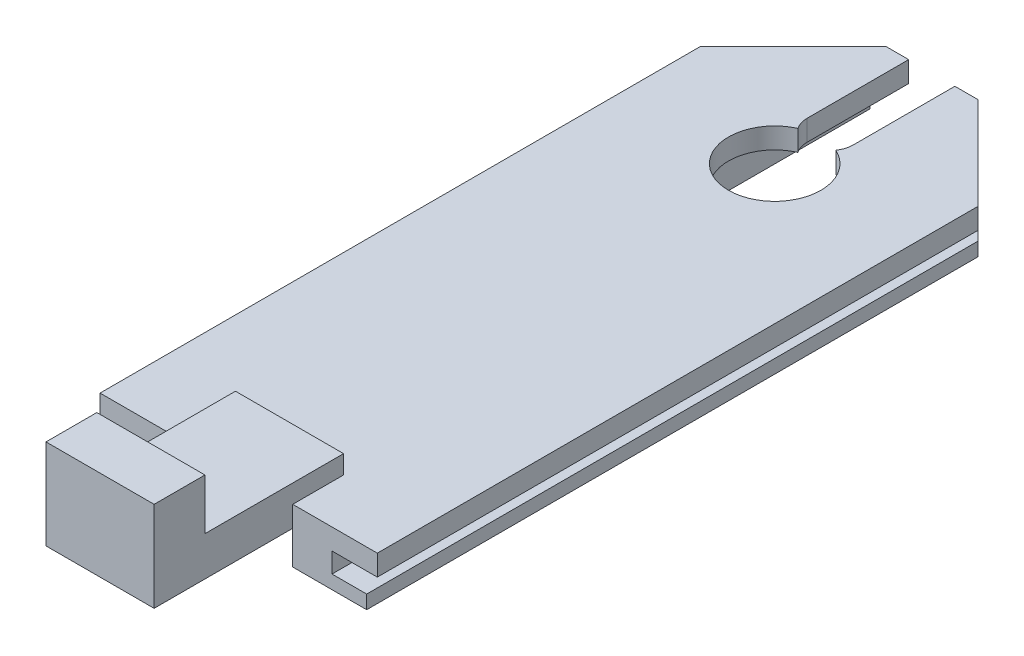
ISO-10303-21;
HEADER;
FILE_DESCRIPTION(('STEP AP214'),'2;1');
FILE_NAME('part.step','',(''),(''),'','','');
FILE_SCHEMA(('AUTOMOTIVE_DESIGN { 1 0 10303 214 1 1 1 1 }'));
ENDSEC;
DATA;
#1=APPLICATION_CONTEXT('core data for automotive mechanical design processes');
#2=APPLICATION_PROTOCOL_DEFINITION('international standard','automotive_design',2000,#1);
#3=PRODUCT_CONTEXT('',#1,'mechanical');
#4=PRODUCT('Part','Part','',(#3));
#5=PRODUCT_RELATED_PRODUCT_CATEGORY('part','',(#4));
#6=PRODUCT_DEFINITION_FORMATION('','',#4);
#7=PRODUCT_DEFINITION_CONTEXT('part definition',#1,'design');
#8=PRODUCT_DEFINITION('design','',#6,#7);
#9=PRODUCT_DEFINITION_SHAPE('','',#8);
#10=(LENGTH_UNIT() NAMED_UNIT(*) SI_UNIT(.MILLI.,.METRE.));
#11=(NAMED_UNIT(*) PLANE_ANGLE_UNIT() SI_UNIT($,.RADIAN.));
#12=(NAMED_UNIT(*) SI_UNIT($,.STERADIAN.) SOLID_ANGLE_UNIT());
#13=UNCERTAINTY_MEASURE_WITH_UNIT(LENGTH_MEASURE(1.E-05),#10,'distance_accuracy_value','');
#14=(GEOMETRIC_REPRESENTATION_CONTEXT(3) GLOBAL_UNCERTAINTY_ASSIGNED_CONTEXT((#13)) GLOBAL_UNIT_ASSIGNED_CONTEXT((#10,
#11,#12)) REPRESENTATION_CONTEXT('',''));
#15=CARTESIAN_POINT('',(0.,0.,0.));
#16=DIRECTION('',(0.,0.,1.));
#17=DIRECTION('',(1.,0.,0.));
#18=AXIS2_PLACEMENT_3D('',#15,#16,#17);
#19=CARTESIAN_POINT('',(0.,-16.646180048888,11.));
#20=DIRECTION('',(0.,1.,0.));
#21=DIRECTION('',(-1.,0.,0.));
#22=AXIS2_PLACEMENT_3D('',#19,#20,#21);
#23=CYLINDRICAL_SURFACE('',#22,2.5);
#24=CARTESIAN_POINT('',(0.,-2.25,11.));
#25=DIRECTION('',(0.,1.,0.));
#26=DIRECTION('',(-1.,0.,0.));
#27=AXIS2_PLACEMENT_3D('',#24,#25,#26);
#28=CIRCLE('',#27,2.5);
#29=CARTESIAN_POINT('',(2.5,-2.25,11.));
#30=VERTEX_POINT('',#29);
#31=CARTESIAN_POINT('',(2.0453835214942,-2.25,12.4375));
#32=VERTEX_POINT('',#31);
#33=EDGE_CURVE('E269',#30,#32,#28,.F.);
#34=ORIENTED_EDGE('',*,*,#33,.T.);
#35=DIRECTION('',(0.,1.,0.));
#36=VECTOR('',#35,1.);
#37=CARTESIAN_POINT('',(2.0453835214942,-1.125,12.4375));
#38=LINE('',#37,#36);
#39=CARTESIAN_POINT('',(2.0453835214942,0.,12.4375));
#40=VERTEX_POINT('',#39);
#41=EDGE_CURVE('E251',#32,#40,#38,.T.);
#42=ORIENTED_EDGE('',*,*,#41,.T.);
#43=CARTESIAN_POINT('',(0.,0.,11.));
#44=DIRECTION('',(0.,1.,0.));
#45=DIRECTION('',(-1.,0.,0.));
#46=AXIS2_PLACEMENT_3D('',#43,#44,#45);
#47=CIRCLE('',#46,2.5);
#48=CARTESIAN_POINT('',(2.5,0.,11.));
#49=VERTEX_POINT('',#48);
#50=EDGE_CURVE('E294',#40,#49,#47,.T.);
#51=ORIENTED_EDGE('',*,*,#50,.T.);
#52=DIRECTION('',(0.,1.,0.));
#53=VECTOR('',#52,1.);
#54=CARTESIAN_POINT('',(2.5,-16.646180048888,11.));
#55=LINE('',#54,#53);
#56=EDGE_CURVE('E277',#30,#49,#55,.T.);
#57=ORIENTED_EDGE('',*,*,#56,.F.);
#58=EDGE_LOOP('',(#34,#42,#51,#57));
#59=FACE_BOUND('',#58,.T.);
#60=ADVANCED_FACE('F47',(#59),#23,.F.);
#61=CARTESIAN_POINT('',(-15.,0.,75.));
#62=DIRECTION('',(0.,-1.,0.));
#63=DIRECTION('',(1.,0.,0.));
#64=AXIS2_PLACEMENT_3D('',#61,#62,#63);
#65=PLANE('',#64);
#66=DIRECTION('',(-1.,0.,0.));
#67=VECTOR('',#66,1.);
#68=CARTESIAN_POINT('',(-15.,0.,0.));
#69=LINE('',#68,#67);
#70=CARTESIAN_POINT('',(-2.5,0.,0.));
#71=VERTEX_POINT('',#70);
#72=CARTESIAN_POINT('',(-4.99999999999996,0.,0.));
#73=VERTEX_POINT('',#72);
#74=EDGE_CURVE('E283',#71,#73,#69,.T.);
#75=ORIENTED_EDGE('',*,*,#74,.T.);
#76=DIRECTION('',(-0.707106781186549,0.,0.707106781186547));
#77=VECTOR('',#76,1.);
#78=CARTESIAN_POINT('',(-15.,0.,10.));
#79=LINE('',#78,#77);
#80=CARTESIAN_POINT('',(-15.,0.,10.));
#81=VERTEX_POINT('',#80);
#82=EDGE_CURVE('E11',#73,#81,#79,.T.);
#83=ORIENTED_EDGE('',*,*,#82,.T.);
#84=DIRECTION('',(0.,0.,-1.));
#85=VECTOR('',#84,1.);
#86=CARTESIAN_POINT('',(-15.,0.,75.));
#87=LINE('',#86,#85);
#88=CARTESIAN_POINT('',(-15.,0.,75.));
#89=VERTEX_POINT('',#88);
#90=EDGE_CURVE('E424',#89,#81,#87,.T.);
#91=ORIENTED_EDGE('',*,*,#90,.F.);
#92=DIRECTION('',(-1.,0.,0.));
#93=VECTOR('',#92,1.);
#94=CARTESIAN_POINT('',(-15.,0.,75.));
#95=LINE('',#94,#93);
#96=CARTESIAN_POINT('',(-5.85,0.,75.));
#97=VERTEX_POINT('',#96);
#98=EDGE_CURVE('E318',#97,#89,#95,.T.);
#99=ORIENTED_EDGE('',*,*,#98,.F.);
#100=DIRECTION('',(0.,0.,1.));
#101=VECTOR('',#100,1.);
#102=CARTESIAN_POINT('',(-5.85,0.,69.5));
#103=LINE('',#102,#101);
#104=CARTESIAN_POINT('',(-5.85,0.,69.5));
#105=VERTEX_POINT('',#104);
#106=EDGE_CURVE('E518',#105,#97,#103,.T.);
#107=ORIENTED_EDGE('',*,*,#106,.F.);
#108=DIRECTION('',(-1.,0.,0.));
#109=VECTOR('',#108,1.);
#110=CARTESIAN_POINT('',(5.85,0.,69.5));
#111=LINE('',#110,#109);
#112=CARTESIAN_POINT('',(5.85,0.,69.5));
#113=VERTEX_POINT('',#112);
#114=EDGE_CURVE('E629',#113,#105,#111,.T.);
#115=ORIENTED_EDGE('',*,*,#114,.F.);
#116=DIRECTION('',(0.,0.,1.));
#117=VECTOR('',#116,1.);
#118=CARTESIAN_POINT('',(5.85,0.,69.5));
#119=LINE('',#118,#117);
#120=CARTESIAN_POINT('',(5.85,0.,75.));
#121=VERTEX_POINT('',#120);
#122=EDGE_CURVE('E527',#113,#121,#119,.T.);
#123=ORIENTED_EDGE('',*,*,#122,.T.);
#124=CARTESIAN_POINT('',(15.,0.,75.));
#125=VERTEX_POINT('',#124);
#126=EDGE_CURVE('E320',#125,#121,#95,.T.);
#127=ORIENTED_EDGE('',*,*,#126,.F.);
#128=DIRECTION('',(0.,0.,-1.));
#129=VECTOR('',#128,1.);
#130=CARTESIAN_POINT('',(15.,0.,75.));
#131=LINE('',#130,#129);
#132=CARTESIAN_POINT('',(15.,0.,10.));
#133=VERTEX_POINT('',#132);
#134=EDGE_CURVE('E428',#125,#133,#131,.T.);
#135=ORIENTED_EDGE('',*,*,#134,.T.);
#136=DIRECTION('',(-0.707106781186549,0.,-0.707106781186547));
#137=VECTOR('',#136,1.);
#138=CARTESIAN_POINT('',(15.,0.,10.));
#139=LINE('',#138,#137);
#140=CARTESIAN_POINT('',(4.99999999999996,0.,0.));
#141=VERTEX_POINT('',#140);
#142=EDGE_CURVE('E437',#133,#141,#139,.T.);
#143=ORIENTED_EDGE('',*,*,#142,.T.);
#144=CARTESIAN_POINT('',(2.5,0.,0.));
#145=VERTEX_POINT('',#144);
#146=EDGE_CURVE('E364',#141,#145,#69,.T.);
#147=ORIENTED_EDGE('',*,*,#146,.T.);
#148=DIRECTION('',(0.,0.,-1.));
#149=VECTOR('',#148,1.);
#150=CARTESIAN_POINT('',(2.5,0.,11.));
#151=LINE('',#150,#149);
#152=EDGE_CURVE('E293',#49,#145,#151,.T.);
#153=ORIENTED_EDGE('',*,*,#152,.F.);
#154=ORIENTED_EDGE('',*,*,#50,.F.);
#155=CARTESIAN_POINT('',(0.,0.,17.));
#156=DIRECTION('',(0.,1.,0.));
#157=DIRECTION('',(-1.,0.,0.));
#158=AXIS2_PLACEMENT_3D('',#155,#156,#157);
#159=CIRCLE('',#158,5.);
#160=CARTESIAN_POINT('',(-2.0453835214942,0.,12.4375));
#161=VERTEX_POINT('',#160);
#162=EDGE_CURVE('E257',#161,#40,#159,.T.);
#163=ORIENTED_EDGE('',*,*,#162,.F.);
#164=CARTESIAN_POINT('',(-2.5,0.,11.));
#165=VERTEX_POINT('',#164);
#166=EDGE_CURVE('E289',#165,#161,#47,.T.);
#167=ORIENTED_EDGE('',*,*,#166,.F.);
#168=DIRECTION('',(0.,0.,1.));
#169=VECTOR('',#168,1.);
#170=CARTESIAN_POINT('',(-2.5,0.,0.));
#171=LINE('',#170,#169);
#172=EDGE_CURVE('E298',#71,#165,#171,.T.);
#173=ORIENTED_EDGE('',*,*,#172,.F.);
#174=EDGE_LOOP('',(#75,#83,#91,#99,#107,#115,#123,#127,#135,#143,#147,#153,#154,#163,#167,#173));
#175=FACE_BOUND('',#174,.T.);
#176=ADVANCED_FACE('F495',(#175),#65,.F.);
#177=CARTESIAN_POINT('',(-5.85,7.5,84.5));
#178=DIRECTION('',(0.,0.,1.));
#179=DIRECTION('',(1.,0.,0.));
#180=AXIS2_PLACEMENT_3D('',#177,#178,#179);
#181=PLANE('',#180);
#182=DIRECTION('',(1.,0.,0.));
#183=VECTOR('',#182,1.);
#184=CARTESIAN_POINT('',(5.85,2.,84.5));
#185=LINE('',#184,#183);
#186=CARTESIAN_POINT('',(-5.85,2.,84.5));
#187=VERTEX_POINT('',#186);
#188=CARTESIAN_POINT('',(5.85,2.,84.5));
#189=VERTEX_POINT('',#188);
#190=EDGE_CURVE('E273',#187,#189,#185,.T.);
#191=ORIENTED_EDGE('',*,*,#190,.F.);
#192=DIRECTION('',(0.,-1.,0.));
#193=VECTOR('',#192,1.);
#194=CARTESIAN_POINT('',(-5.85,7.5,84.5));
#195=LINE('',#194,#193);
#196=CARTESIAN_POINT('',(-5.85,7.5,84.5));
#197=VERTEX_POINT('',#196);
#198=EDGE_CURVE('E552',#197,#187,#195,.T.);
#199=ORIENTED_EDGE('',*,*,#198,.F.);
#200=DIRECTION('',(-1.,0.,0.));
#201=VECTOR('',#200,1.);
#202=CARTESIAN_POINT('',(-5.85,7.5,84.5));
#203=LINE('',#202,#201);
#204=CARTESIAN_POINT('',(5.85,7.5,84.5));
#205=VERTEX_POINT('',#204);
#206=EDGE_CURVE('E549',#205,#197,#203,.T.);
#207=ORIENTED_EDGE('',*,*,#206,.F.);
#208=DIRECTION('',(0.,-1.,0.));
#209=VECTOR('',#208,1.);
#210=CARTESIAN_POINT('',(5.85,7.5,84.5));
#211=LINE('',#210,#209);
#212=EDGE_CURVE('E556',#205,#189,#211,.T.);
#213=ORIENTED_EDGE('',*,*,#212,.T.);
#214=EDGE_LOOP('',(#191,#199,#207,#213));
#215=FACE_BOUND('',#214,.T.);
#216=ADVANCED_FACE('F619',(#215),#181,.F.);
#217=CARTESIAN_POINT('',(0.,0.,75.));
#218=DIRECTION('',(0.,0.,-1.));
#219=DIRECTION('',(-1.,0.,0.));
#220=AXIS2_PLACEMENT_3D('',#217,#218,#219);
#221=PLANE('',#220);
#222=DIRECTION('',(0.,-1.,0.));
#223=VECTOR('',#222,1.);
#224=CARTESIAN_POINT('',(-5.85,-2.25,75.));
#225=LINE('',#224,#223);
#226=CARTESIAN_POINT('',(-5.85,-2.25,75.));
#227=VERTEX_POINT('',#226);
#228=EDGE_CURVE('E516',#97,#227,#225,.T.);
#229=ORIENTED_EDGE('',*,*,#228,.F.);
#230=ORIENTED_EDGE('',*,*,#98,.T.);
#231=DIRECTION('',(0.,-1.,0.));
#232=VECTOR('',#231,1.);
#233=CARTESIAN_POINT('',(-15.,0.,75.));
#234=LINE('',#233,#232);
#235=CARTESIAN_POINT('',(-15.,-2.25,75.));
#236=VERTEX_POINT('',#235);
#237=EDGE_CURVE('E324',#89,#236,#234,.T.);
#238=ORIENTED_EDGE('',*,*,#237,.T.);
#239=DIRECTION('',(1.,0.,0.));
#240=VECTOR('',#239,1.);
#241=CARTESIAN_POINT('',(-15.,-2.25,75.));
#242=LINE('',#241,#240);
#243=CARTESIAN_POINT('',(-10.1,-2.25,75.));
#244=VERTEX_POINT('',#243);
#245=EDGE_CURVE('E327',#236,#244,#242,.T.);
#246=ORIENTED_EDGE('',*,*,#245,.T.);
#247=DIRECTION('',(0.,-1.,0.));
#248=VECTOR('',#247,1.);
#249=CARTESIAN_POINT('',(-10.1,-2.25,75.));
#250=LINE('',#249,#248);
#251=CARTESIAN_POINT('',(-10.1,-4.41,75.));
#252=VERTEX_POINT('',#251);
#253=EDGE_CURVE('E330',#244,#252,#250,.T.);
#254=ORIENTED_EDGE('',*,*,#253,.T.);
#255=DIRECTION('',(-1.,0.,0.));
#256=VECTOR('',#255,1.);
#257=CARTESIAN_POINT('',(-10.1,-4.41,75.));
#258=LINE('',#257,#256);
#259=CARTESIAN_POINT('',(-13.85,-4.41,75.));
#260=VERTEX_POINT('',#259);
#261=EDGE_CURVE('E333',#252,#260,#258,.T.);
#262=ORIENTED_EDGE('',*,*,#261,.T.);
#263=DIRECTION('',(0.,-1.,0.));
#264=VECTOR('',#263,1.);
#265=CARTESIAN_POINT('',(-13.85,-4.41,75.));
#266=LINE('',#265,#264);
#267=CARTESIAN_POINT('',(-13.85,-5.88,75.));
#268=VERTEX_POINT('',#267);
#269=EDGE_CURVE('E336',#260,#268,#266,.T.);
#270=ORIENTED_EDGE('',*,*,#269,.T.);
#271=DIRECTION('',(1.,0.,0.));
#272=VECTOR('',#271,1.);
#273=CARTESIAN_POINT('',(-13.85,-5.88,75.));
#274=LINE('',#273,#272);
#275=CARTESIAN_POINT('',(-5.85,-5.88,75.));
#276=VERTEX_POINT('',#275);
#277=EDGE_CURVE('E339',#268,#276,#274,.T.);
#278=ORIENTED_EDGE('',*,*,#277,.T.);
#279=DIRECTION('',(0.,1.,0.));
#280=VECTOR('',#279,1.);
#281=CARTESIAN_POINT('',(-5.85,-5.88,75.));
#282=LINE('',#281,#280);
#283=EDGE_CURVE('E342',#276,#227,#282,.T.);
#284=ORIENTED_EDGE('',*,*,#283,.T.);
#285=EDGE_LOOP('',(#229,#230,#238,#246,#254,#262,#270,#278,#284));
#286=FACE_BOUND('',#285,.T.);
#287=ADVANCED_FACE('F512',(#286),#221,.F.);
#288=DIRECTION('',(0.,1.,0.));
#289=VECTOR('',#288,1.);
#290=CARTESIAN_POINT('',(5.85,-2.25,75.));
#291=LINE('',#290,#289);
#292=CARTESIAN_POINT('',(5.85,-2.25,75.));
#293=VERTEX_POINT('',#292);
#294=EDGE_CURVE('E564',#293,#121,#291,.T.);
#295=ORIENTED_EDGE('',*,*,#294,.F.);
#296=DIRECTION('',(0.,-1.,0.));
#297=VECTOR('',#296,1.);
#298=CARTESIAN_POINT('',(5.85,-5.88,75.));
#299=LINE('',#298,#297);
#300=CARTESIAN_POINT('',(5.85,-5.88,75.));
#301=VERTEX_POINT('',#300);
#302=EDGE_CURVE('E345',#293,#301,#299,.T.);
#303=ORIENTED_EDGE('',*,*,#302,.T.);
#304=DIRECTION('',(1.,0.,0.));
#305=VECTOR('',#304,1.);
#306=CARTESIAN_POINT('',(13.85,-5.88,75.));
#307=LINE('',#306,#305);
#308=CARTESIAN_POINT('',(13.85,-5.88,75.));
#309=VERTEX_POINT('',#308);
#310=EDGE_CURVE('E348',#301,#309,#307,.T.);
#311=ORIENTED_EDGE('',*,*,#310,.T.);
#312=DIRECTION('',(0.,1.,0.));
#313=VECTOR('',#312,1.);
#314=CARTESIAN_POINT('',(13.85,-4.41,75.));
#315=LINE('',#314,#313);
#316=CARTESIAN_POINT('',(13.85,-4.41,75.));
#317=VERTEX_POINT('',#316);
#318=EDGE_CURVE('E351',#309,#317,#315,.T.);
#319=ORIENTED_EDGE('',*,*,#318,.T.);
#320=DIRECTION('',(-1.,0.,0.));
#321=VECTOR('',#320,1.);
#322=CARTESIAN_POINT('',(10.1,-4.41,75.));
#323=LINE('',#322,#321);
#324=CARTESIAN_POINT('',(10.1,-4.41,75.));
#325=VERTEX_POINT('',#324);
#326=EDGE_CURVE('E354',#317,#325,#323,.T.);
#327=ORIENTED_EDGE('',*,*,#326,.T.);
#328=DIRECTION('',(0.,1.,0.));
#329=VECTOR('',#328,1.);
#330=CARTESIAN_POINT('',(10.1,-2.25,75.));
#331=LINE('',#330,#329);
#332=CARTESIAN_POINT('',(10.1,-2.25,75.));
#333=VERTEX_POINT('',#332);
#334=EDGE_CURVE('E357',#325,#333,#331,.T.);
#335=ORIENTED_EDGE('',*,*,#334,.T.);
#336=DIRECTION('',(1.,0.,0.));
#337=VECTOR('',#336,1.);
#338=CARTESIAN_POINT('',(15.,-2.25,75.));
#339=LINE('',#338,#337);
#340=CARTESIAN_POINT('',(15.,-2.25,75.));
#341=VERTEX_POINT('',#340);
#342=EDGE_CURVE('E360',#333,#341,#339,.T.);
#343=ORIENTED_EDGE('',*,*,#342,.T.);
#344=DIRECTION('',(0.,1.,0.));
#345=VECTOR('',#344,1.);
#346=CARTESIAN_POINT('',(15.,0.,75.));
#347=LINE('',#346,#345);
#348=EDGE_CURVE('E314',#341,#125,#347,.T.);
#349=ORIENTED_EDGE('',*,*,#348,.T.);
#350=ORIENTED_EDGE('',*,*,#126,.T.);
#351=EDGE_LOOP('',(#295,#303,#311,#319,#327,#335,#343,#349,#350));
#352=FACE_BOUND('',#351,.T.);
#353=ADVANCED_FACE('F645',(#352),#221,.F.);
#354=CARTESIAN_POINT('',(0.,0.,0.));
#355=DIRECTION('',(0.,0.,-1.));
#356=DIRECTION('',(-1.,0.,0.));
#357=AXIS2_PLACEMENT_3D('',#354,#355,#356);
#358=PLANE('',#357);
#359=DIRECTION('',(1.,0.,0.));
#360=VECTOR('',#359,1.);
#361=CARTESIAN_POINT('',(5.85,-2.25,0.));
#362=LINE('',#361,#360);
#363=CARTESIAN_POINT('',(-4.99999999999996,-2.25,0.));
#364=VERTEX_POINT('',#363);
#365=CARTESIAN_POINT('',(-2.5,-2.25,0.));
#366=VERTEX_POINT('',#365);
#367=EDGE_CURVE('E319',#364,#366,#362,.T.);
#368=ORIENTED_EDGE('',*,*,#367,.F.);
#369=DIRECTION('',(0.,1.,0.));
#370=VECTOR('',#369,1.);
#371=CARTESIAN_POINT('',(-4.99999999999996,0.,0.));
#372=LINE('',#371,#370);
#373=EDGE_CURVE('E57',#364,#73,#372,.T.);
#374=ORIENTED_EDGE('',*,*,#373,.T.);
#375=ORIENTED_EDGE('',*,*,#74,.F.);
#376=DIRECTION('',(0.,1.,0.));
#377=VECTOR('',#376,1.);
#378=CARTESIAN_POINT('',(-2.5,-16.646180048888,0.));
#379=LINE('',#378,#377);
#380=EDGE_CURVE('E305',#366,#71,#379,.T.);
#381=ORIENTED_EDGE('',*,*,#380,.F.);
#382=EDGE_LOOP('',(#368,#374,#375,#381));
#383=FACE_BOUND('',#382,.T.);
#384=ADVANCED_FACE('F700',(#383),#358,.T.);
#385=CARTESIAN_POINT('',(15.,0.,75.));
#386=DIRECTION('',(-1.,0.,0.));
#387=DIRECTION('',(0.,0.,1.));
#388=AXIS2_PLACEMENT_3D('',#385,#386,#387);
#389=PLANE('',#388);
#390=DIRECTION('',(0.,0.,-1.));
#391=VECTOR('',#390,1.);
#392=CARTESIAN_POINT('',(15.,-2.25,75.));
#393=LINE('',#392,#391);
#394=CARTESIAN_POINT('',(15.,-2.25,10.));
#395=VERTEX_POINT('',#394);
#396=EDGE_CURVE('E363',#341,#395,#393,.T.);
#397=ORIENTED_EDGE('',*,*,#396,.T.);
#398=DIRECTION('',(0.,1.,0.));
#399=VECTOR('',#398,1.);
#400=CARTESIAN_POINT('',(15.,0.,10.));
#401=LINE('',#400,#399);
#402=EDGE_CURVE('E262',#395,#133,#401,.T.);
#403=ORIENTED_EDGE('',*,*,#402,.T.);
#404=ORIENTED_EDGE('',*,*,#134,.F.);
#405=ORIENTED_EDGE('',*,*,#348,.F.);
#406=EDGE_LOOP('',(#397,#403,#404,#405));
#407=FACE_BOUND('',#406,.T.);
#408=ADVANCED_FACE('F651',(#407),#389,.F.);
#409=CARTESIAN_POINT('',(-15.,0.,75.));
#410=DIRECTION('',(1.,0.,0.));
#411=DIRECTION('',(0.,0.,-1.));
#412=AXIS2_PLACEMENT_3D('',#409,#410,#411);
#413=PLANE('',#412);
#414=ORIENTED_EDGE('',*,*,#90,.T.);
#415=DIRECTION('',(0.,-1.,0.));
#416=VECTOR('',#415,1.);
#417=CARTESIAN_POINT('',(-15.,-2.25,10.));
#418=LINE('',#417,#416);
#419=CARTESIAN_POINT('',(-15.,-2.25,10.));
#420=VERTEX_POINT('',#419);
#421=EDGE_CURVE('E464',#81,#420,#418,.T.);
#422=ORIENTED_EDGE('',*,*,#421,.T.);
#423=DIRECTION('',(0.,0.,-1.));
#424=VECTOR('',#423,1.);
#425=CARTESIAN_POINT('',(-15.,-2.25,75.));
#426=LINE('',#425,#424);
#427=EDGE_CURVE('E420',#236,#420,#426,.T.);
#428=ORIENTED_EDGE('',*,*,#427,.F.);
#429=ORIENTED_EDGE('',*,*,#237,.F.);
#430=EDGE_LOOP('',(#414,#422,#428,#429));
#431=FACE_BOUND('',#430,.T.);
#432=ADVANCED_FACE('F504',(#431),#413,.F.);
#433=CARTESIAN_POINT('',(-15.,-2.25,75.));
#434=DIRECTION('',(0.,1.,0.));
#435=DIRECTION('',(-1.,0.,0.));
#436=AXIS2_PLACEMENT_3D('',#433,#434,#435);
#437=PLANE('',#436);
#438=ORIENTED_EDGE('',*,*,#427,.T.);
#439=DIRECTION('',(0.707106781186549,0.,-0.707106781186547));
#440=VECTOR('',#439,1.);
#441=CARTESIAN_POINT('',(-15.,-2.25,10.));
#442=LINE('',#441,#440);
#443=CARTESIAN_POINT('',(-10.1,-2.25,5.10000000000002));
#444=VERTEX_POINT('',#443);
#445=EDGE_CURVE('E468',#420,#444,#442,.T.);
#446=ORIENTED_EDGE('',*,*,#445,.T.);
#447=DIRECTION('',(0.,0.,-1.));
#448=VECTOR('',#447,1.);
#449=CARTESIAN_POINT('',(-10.1,-2.25,75.));
#450=LINE('',#449,#448);
#451=EDGE_CURVE('E416',#244,#444,#450,.T.);
#452=ORIENTED_EDGE('',*,*,#451,.F.);
#453=ORIENTED_EDGE('',*,*,#245,.F.);
#454=EDGE_LOOP('',(#438,#446,#452,#453));
#455=FACE_BOUND('',#454,.T.);
#456=ADVANCED_FACE('F508',(#455),#437,.F.);
#457=CARTESIAN_POINT('',(-10.1,-2.25,75.));
#458=DIRECTION('',(1.,0.,0.));
#459=DIRECTION('',(0.,1.,0.));
#460=AXIS2_PLACEMENT_3D('',#457,#458,#459);
#461=PLANE('',#460);
#462=ORIENTED_EDGE('',*,*,#451,.T.);
#463=DIRECTION('',(0.,-1.,0.));
#464=VECTOR('',#463,1.);
#465=CARTESIAN_POINT('',(-10.1,0.,5.10000000000002));
#466=LINE('',#465,#464);
#467=CARTESIAN_POINT('',(-10.1,-4.41,5.10000000000002));
#468=VERTEX_POINT('',#467);
#469=EDGE_CURVE('E471',#444,#468,#466,.T.);
#470=ORIENTED_EDGE('',*,*,#469,.T.);
#471=DIRECTION('',(0.,0.,-1.));
#472=VECTOR('',#471,1.);
#473=CARTESIAN_POINT('',(-10.1,-4.41,75.));
#474=LINE('',#473,#472);
#475=EDGE_CURVE('E412',#252,#468,#474,.T.);
#476=ORIENTED_EDGE('',*,*,#475,.F.);
#477=ORIENTED_EDGE('',*,*,#253,.F.);
#478=EDGE_LOOP('',(#462,#470,#476,#477));
#479=FACE_BOUND('',#478,.T.);
#480=ADVANCED_FACE('F888',(#479),#461,.F.);
#481=CARTESIAN_POINT('',(-10.1,-4.41,75.));
#482=DIRECTION('',(0.,-1.,0.));
#483=DIRECTION('',(1.,0.,0.));
#484=AXIS2_PLACEMENT_3D('',#481,#482,#483);
#485=PLANE('',#484);
#486=ORIENTED_EDGE('',*,*,#475,.T.);
#487=DIRECTION('',(-0.707106781186549,0.,0.707106781186547));
#488=VECTOR('',#487,1.);
#489=CARTESIAN_POINT('',(-15.,-4.41,10.));
#490=LINE('',#489,#488);
#491=CARTESIAN_POINT('',(-13.85,-4.41,8.85000000000001));
#492=VERTEX_POINT('',#491);
#493=EDGE_CURVE('E474',#468,#492,#490,.T.);
#494=ORIENTED_EDGE('',*,*,#493,.T.);
#495=DIRECTION('',(0.,0.,-1.));
#496=VECTOR('',#495,1.);
#497=CARTESIAN_POINT('',(-13.85,-4.41,75.));
#498=LINE('',#497,#496);
#499=EDGE_CURVE('E408',#260,#492,#498,.T.);
#500=ORIENTED_EDGE('',*,*,#499,.F.);
#501=ORIENTED_EDGE('',*,*,#261,.F.);
#502=EDGE_LOOP('',(#486,#494,#500,#501));
#503=FACE_BOUND('',#502,.T.);
#504=ADVANCED_FACE('F876',(#503),#485,.F.);
#505=CARTESIAN_POINT('',(-13.85,-4.41,75.));
#506=DIRECTION('',(1.,0.,0.));
#507=DIRECTION('',(0.,0.,-1.));
#508=AXIS2_PLACEMENT_3D('',#505,#506,#507);
#509=PLANE('',#508);
#510=ORIENTED_EDGE('',*,*,#499,.T.);
#511=DIRECTION('',(0.,-1.,0.));
#512=VECTOR('',#511,1.);
#513=CARTESIAN_POINT('',(-13.85,0.,8.85000000000001));
#514=LINE('',#513,#512);
#515=CARTESIAN_POINT('',(-13.85,-5.88,8.85000000000001));
#516=VERTEX_POINT('',#515);
#517=EDGE_CURVE('E477',#492,#516,#514,.T.);
#518=ORIENTED_EDGE('',*,*,#517,.T.);
#519=DIRECTION('',(0.,0.,-1.));
#520=VECTOR('',#519,1.);
#521=CARTESIAN_POINT('',(-13.85,-5.88,75.));
#522=LINE('',#521,#520);
#523=EDGE_CURVE('E404',#268,#516,#522,.T.);
#524=ORIENTED_EDGE('',*,*,#523,.F.);
#525=ORIENTED_EDGE('',*,*,#269,.F.);
#526=EDGE_LOOP('',(#510,#518,#524,#525));
#527=FACE_BOUND('',#526,.T.);
#528=ADVANCED_FACE('F864',(#527),#509,.F.);
#529=CARTESIAN_POINT('',(-13.85,-5.88,75.));
#530=DIRECTION('',(0.,1.,0.));
#531=DIRECTION('',(0.,0.,1.));
#532=AXIS2_PLACEMENT_3D('',#529,#530,#531);
#533=PLANE('',#532);
#534=ORIENTED_EDGE('',*,*,#523,.T.);
#535=DIRECTION('',(0.707106781186549,0.,-0.707106781186547));
#536=VECTOR('',#535,1.);
#537=CARTESIAN_POINT('',(-15.,-5.88,10.));
#538=LINE('',#537,#536);
#539=CARTESIAN_POINT('',(-5.85,-5.88,0.850000000000031));
#540=VERTEX_POINT('',#539);
#541=EDGE_CURVE('E480',#516,#540,#538,.T.);
#542=ORIENTED_EDGE('',*,*,#541,.T.);
#543=DIRECTION('',(0.,0.,-1.));
#544=VECTOR('',#543,1.);
#545=CARTESIAN_POINT('',(-5.85,-5.88,75.));
#546=LINE('',#545,#544);
#547=EDGE_CURVE('E400',#276,#540,#546,.T.);
#548=ORIENTED_EDGE('',*,*,#547,.F.);
#549=ORIENTED_EDGE('',*,*,#277,.F.);
#550=EDGE_LOOP('',(#534,#542,#548,#549));
#551=FACE_BOUND('',#550,.T.);
#552=ADVANCED_FACE('F852',(#551),#533,.F.);
#553=CARTESIAN_POINT('',(-5.85,-5.88,75.));
#554=DIRECTION('',(-1.,0.,0.));
#555=DIRECTION('',(0.,-1.,0.));
#556=AXIS2_PLACEMENT_3D('',#553,#554,#555);
#557=PLANE('',#556);
#558=ORIENTED_EDGE('',*,*,#547,.T.);
#559=DIRECTION('',(0.,1.,0.));
#560=VECTOR('',#559,1.);
#561=CARTESIAN_POINT('',(-5.85,0.,0.850000000000037));
#562=LINE('',#561,#560);
#563=CARTESIAN_POINT('',(-5.85,-2.25,0.850000000000031));
#564=VERTEX_POINT('',#563);
#565=EDGE_CURVE('E483',#540,#564,#562,.T.);
#566=ORIENTED_EDGE('',*,*,#565,.T.);
#567=DIRECTION('',(0.,0.,-1.));
#568=VECTOR('',#567,1.);
#569=CARTESIAN_POINT('',(-5.85,-2.25,75.));
#570=LINE('',#569,#568);
#571=EDGE_CURVE('E397',#227,#564,#570,.T.);
#572=ORIENTED_EDGE('',*,*,#571,.F.);
#573=ORIENTED_EDGE('',*,*,#283,.F.);
#574=EDGE_LOOP('',(#558,#566,#572,#573));
#575=FACE_BOUND('',#574,.T.);
#576=ADVANCED_FACE('F838',(#575),#557,.F.);
#577=CARTESIAN_POINT('',(5.85,-2.25,75.));
#578=DIRECTION('',(0.,1.,0.));
#579=DIRECTION('',(-1.,0.,0.));
#580=AXIS2_PLACEMENT_3D('',#577,#578,#579);
#581=PLANE('',#580);
#582=ORIENTED_EDGE('',*,*,#571,.T.);
#583=DIRECTION('',(0.707106781186549,0.,-0.707106781186547));
#584=VECTOR('',#583,1.);
#585=CARTESIAN_POINT('',(-15.,-2.25,10.));
#586=LINE('',#585,#584);
#587=EDGE_CURVE('E71',#564,#364,#586,.T.);
#588=ORIENTED_EDGE('',*,*,#587,.T.);
#589=ORIENTED_EDGE('',*,*,#367,.T.);
#590=DIRECTION('',(0.,0.,-1.));
#591=VECTOR('',#590,1.);
#592=CARTESIAN_POINT('',(-2.5,-2.25,0.));
#593=LINE('',#592,#591);
#594=CARTESIAN_POINT('',(-2.5,-2.25,11.));
#595=VERTEX_POINT('',#594);
#596=EDGE_CURVE('E285',#595,#366,#593,.T.);
#597=ORIENTED_EDGE('',*,*,#596,.F.);
#598=CARTESIAN_POINT('',(-2.0453835214942,-2.25,12.4375));
#599=VERTEX_POINT('',#598);
#600=EDGE_CURVE('E271',#599,#595,#28,.F.);
#601=ORIENTED_EDGE('',*,*,#600,.F.);
#602=CARTESIAN_POINT('',(0.,-2.25,17.));
#603=DIRECTION('',(0.,1.,0.));
#604=DIRECTION('',(-1.,0.,0.));
#605=AXIS2_PLACEMENT_3D('',#602,#603,#604);
#606=CIRCLE('',#605,5.);
#607=EDGE_CURVE('E254',#32,#599,#606,.F.);
#608=ORIENTED_EDGE('',*,*,#607,.F.);
#609=ORIENTED_EDGE('',*,*,#33,.F.);
#610=DIRECTION('',(0.,0.,1.));
#611=VECTOR('',#610,1.);
#612=CARTESIAN_POINT('',(2.5,-2.25,11.));
#613=LINE('',#612,#611);
#614=CARTESIAN_POINT('',(2.5,-2.25,0.));
#615=VERTEX_POINT('',#614);
#616=EDGE_CURVE('E279',#615,#30,#613,.T.);
#617=ORIENTED_EDGE('',*,*,#616,.F.);
#618=CARTESIAN_POINT('',(4.99999999999996,-2.25,0.));
#619=VERTEX_POINT('',#618);
#620=EDGE_CURVE('E367',#615,#619,#362,.T.);
#621=ORIENTED_EDGE('',*,*,#620,.T.);
#622=DIRECTION('',(0.707106781186549,0.,0.707106781186547));
#623=VECTOR('',#622,1.);
#624=CARTESIAN_POINT('',(15.,-2.25,10.));
#625=LINE('',#624,#623);
#626=CARTESIAN_POINT('',(5.85,-2.25,0.850000000000031));
#627=VERTEX_POINT('',#626);
#628=EDGE_CURVE('E443',#619,#627,#625,.T.);
#629=ORIENTED_EDGE('',*,*,#628,.T.);
#630=DIRECTION('',(0.,0.,-1.));
#631=VECTOR('',#630,1.);
#632=CARTESIAN_POINT('',(5.85,-2.25,75.));
#633=LINE('',#632,#631);
#634=EDGE_CURVE('E393',#293,#627,#633,.T.);
#635=ORIENTED_EDGE('',*,*,#634,.F.);
#636=DIRECTION('',(0.,0.,-1.));
#637=VECTOR('',#636,1.);
#638=CARTESIAN_POINT('',(5.85,-2.25,90.));
#639=LINE('',#638,#637);
#640=CARTESIAN_POINT('',(5.85,-2.25,90.));
#641=VERTEX_POINT('',#640);
#642=EDGE_CURVE('E570',#641,#293,#639,.T.);
#643=ORIENTED_EDGE('',*,*,#642,.F.);
#644=DIRECTION('',(1.,0.,0.));
#645=VECTOR('',#644,1.);
#646=CARTESIAN_POINT('',(-5.85,-2.25,90.));
#647=LINE('',#646,#645);
#648=CARTESIAN_POINT('',(-5.85,-2.25,90.));
#649=VERTEX_POINT('',#648);
#650=EDGE_CURVE('E563',#649,#641,#647,.T.);
#651=ORIENTED_EDGE('',*,*,#650,.F.);
#652=DIRECTION('',(0.,0.,-1.));
#653=VECTOR('',#652,1.);
#654=CARTESIAN_POINT('',(-5.85,-2.25,90.));
#655=LINE('',#654,#653);
#656=EDGE_CURVE('E578',#649,#227,#655,.T.);
#657=ORIENTED_EDGE('',*,*,#656,.T.);
#658=EDGE_LOOP('',(#582,#588,#589,#597,#601,#608,#609,#617,#621,#629,#635,#643,#651,#657));
#659=FACE_BOUND('',#658,.T.);
#660=ADVANCED_FACE('F267',(#659),#581,.F.);
#661=CARTESIAN_POINT('',(5.85,-5.88,75.));
#662=DIRECTION('',(1.,0.,0.));
#663=DIRECTION('',(0.,0.,-1.));
#664=AXIS2_PLACEMENT_3D('',#661,#662,#663);
#665=PLANE('',#664);
#666=ORIENTED_EDGE('',*,*,#634,.T.);
#667=DIRECTION('',(0.,-1.,0.));
#668=VECTOR('',#667,1.);
#669=CARTESIAN_POINT('',(5.85,0.,0.850000000000035));
#670=LINE('',#669,#668);
#671=CARTESIAN_POINT('',(5.85,-5.88,0.850000000000031));
#672=VERTEX_POINT('',#671);
#673=EDGE_CURVE('E446',#627,#672,#670,.T.);
#674=ORIENTED_EDGE('',*,*,#673,.T.);
#675=DIRECTION('',(0.,0.,-1.));
#676=VECTOR('',#675,1.);
#677=CARTESIAN_POINT('',(5.85,-5.88,75.));
#678=LINE('',#677,#676);
#679=EDGE_CURVE('E389',#301,#672,#678,.T.);
#680=ORIENTED_EDGE('',*,*,#679,.F.);
#681=ORIENTED_EDGE('',*,*,#302,.F.);
#682=EDGE_LOOP('',(#666,#674,#680,#681));
#683=FACE_BOUND('',#682,.T.);
#684=ADVANCED_FACE('F600',(#683),#665,.F.);
#685=CARTESIAN_POINT('',(13.85,-5.88,75.));
#686=DIRECTION('',(0.,1.,0.));
#687=DIRECTION('',(-1.,0.,0.));
#688=AXIS2_PLACEMENT_3D('',#685,#686,#687);
#689=PLANE('',#688);
#690=ORIENTED_EDGE('',*,*,#679,.T.);
#691=DIRECTION('',(0.707106781186549,0.,0.707106781186547));
#692=VECTOR('',#691,1.);
#693=CARTESIAN_POINT('',(15.,-5.88,10.));
#694=LINE('',#693,#692);
#695=CARTESIAN_POINT('',(13.85,-5.88,8.85000000000001));
#696=VERTEX_POINT('',#695);
#697=EDGE_CURVE('E449',#672,#696,#694,.T.);
#698=ORIENTED_EDGE('',*,*,#697,.T.);
#699=DIRECTION('',(0.,0.,-1.));
#700=VECTOR('',#699,1.);
#701=CARTESIAN_POINT('',(13.85,-5.88,75.));
#702=LINE('',#701,#700);
#703=EDGE_CURVE('E385',#309,#696,#702,.T.);
#704=ORIENTED_EDGE('',*,*,#703,.F.);
#705=ORIENTED_EDGE('',*,*,#310,.F.);
#706=EDGE_LOOP('',(#690,#698,#704,#705));
#707=FACE_BOUND('',#706,.T.);
#708=ADVANCED_FACE('F672',(#707),#689,.F.);
#709=CARTESIAN_POINT('',(13.85,-4.41,75.));
#710=DIRECTION('',(-1.,0.,0.));
#711=DIRECTION('',(0.,0.,1.));
#712=AXIS2_PLACEMENT_3D('',#709,#710,#711);
#713=PLANE('',#712);
#714=ORIENTED_EDGE('',*,*,#703,.T.);
#715=DIRECTION('',(0.,1.,0.));
#716=VECTOR('',#715,1.);
#717=CARTESIAN_POINT('',(13.85,0.,8.85000000000001));
#718=LINE('',#717,#716);
#719=CARTESIAN_POINT('',(13.85,-4.41,8.85000000000001));
#720=VERTEX_POINT('',#719);
#721=EDGE_CURVE('E452',#696,#720,#718,.T.);
#722=ORIENTED_EDGE('',*,*,#721,.T.);
#723=DIRECTION('',(0.,0.,-1.));
#724=VECTOR('',#723,1.);
#725=CARTESIAN_POINT('',(13.85,-4.41,75.));
#726=LINE('',#725,#724);
#727=EDGE_CURVE('E381',#317,#720,#726,.T.);
#728=ORIENTED_EDGE('',*,*,#727,.F.);
#729=ORIENTED_EDGE('',*,*,#318,.F.);
#730=EDGE_LOOP('',(#714,#722,#728,#729));
#731=FACE_BOUND('',#730,.T.);
#732=ADVANCED_FACE('F668',(#731),#713,.F.);
#733=CARTESIAN_POINT('',(10.1,-4.41,75.));
#734=DIRECTION('',(0.,-1.,0.));
#735=DIRECTION('',(0.,0.,-1.));
#736=AXIS2_PLACEMENT_3D('',#733,#734,#735);
#737=PLANE('',#736);
#738=ORIENTED_EDGE('',*,*,#727,.T.);
#739=DIRECTION('',(-0.707106781186549,0.,-0.707106781186547));
#740=VECTOR('',#739,1.);
#741=CARTESIAN_POINT('',(15.,-4.41,10.));
#742=LINE('',#741,#740);
#743=CARTESIAN_POINT('',(10.1,-4.41,5.10000000000002));
#744=VERTEX_POINT('',#743);
#745=EDGE_CURVE('E455',#720,#744,#742,.T.);
#746=ORIENTED_EDGE('',*,*,#745,.T.);
#747=DIRECTION('',(0.,0.,-1.));
#748=VECTOR('',#747,1.);
#749=CARTESIAN_POINT('',(10.1,-4.41,75.));
#750=LINE('',#749,#748);
#751=EDGE_CURVE('E377',#325,#744,#750,.T.);
#752=ORIENTED_EDGE('',*,*,#751,.F.);
#753=ORIENTED_EDGE('',*,*,#326,.F.);
#754=EDGE_LOOP('',(#738,#746,#752,#753));
#755=FACE_BOUND('',#754,.T.);
#756=ADVANCED_FACE('F664',(#755),#737,.F.);
#757=CARTESIAN_POINT('',(10.1,-2.25,75.));
#758=DIRECTION('',(-1.,0.,0.));
#759=DIRECTION('',(0.,-1.,0.));
#760=AXIS2_PLACEMENT_3D('',#757,#758,#759);
#761=PLANE('',#760);
#762=ORIENTED_EDGE('',*,*,#751,.T.);
#763=DIRECTION('',(0.,1.,0.));
#764=VECTOR('',#763,1.);
#765=CARTESIAN_POINT('',(10.1,0.,5.10000000000002));
#766=LINE('',#765,#764);
#767=CARTESIAN_POINT('',(10.1,-2.25,5.10000000000002));
#768=VERTEX_POINT('',#767);
#769=EDGE_CURVE('E458',#744,#768,#766,.T.);
#770=ORIENTED_EDGE('',*,*,#769,.T.);
#771=DIRECTION('',(0.,0.,-1.));
#772=VECTOR('',#771,1.);
#773=CARTESIAN_POINT('',(10.1,-2.25,75.));
#774=LINE('',#773,#772);
#775=EDGE_CURVE('E373',#333,#768,#774,.T.);
#776=ORIENTED_EDGE('',*,*,#775,.F.);
#777=ORIENTED_EDGE('',*,*,#334,.F.);
#778=EDGE_LOOP('',(#762,#770,#776,#777));
#779=FACE_BOUND('',#778,.T.);
#780=ADVANCED_FACE('F660',(#779),#761,.F.);
#781=CARTESIAN_POINT('',(15.,-2.25,75.));
#782=DIRECTION('',(0.,1.,0.));
#783=DIRECTION('',(-1.,0.,0.));
#784=AXIS2_PLACEMENT_3D('',#781,#782,#783);
#785=PLANE('',#784);
#786=ORIENTED_EDGE('',*,*,#775,.T.);
#787=DIRECTION('',(0.707106781186549,0.,0.707106781186547));
#788=VECTOR('',#787,1.);
#789=CARTESIAN_POINT('',(15.,-2.25,10.));
#790=LINE('',#789,#788);
#791=EDGE_CURVE('E461',#768,#395,#790,.T.);
#792=ORIENTED_EDGE('',*,*,#791,.T.);
#793=ORIENTED_EDGE('',*,*,#396,.F.);
#794=ORIENTED_EDGE('',*,*,#342,.F.);
#795=EDGE_LOOP('',(#786,#792,#793,#794));
#796=FACE_BOUND('',#795,.T.);
#797=ADVANCED_FACE('F656',(#796),#785,.F.);
#798=ORIENTED_EDGE('',*,*,#146,.F.);
#799=DIRECTION('',(0.,-1.,0.));
#800=VECTOR('',#799,1.);
#801=CARTESIAN_POINT('',(4.99999999999996,-2.25,0.));
#802=LINE('',#801,#800);
#803=EDGE_CURVE('E440',#141,#619,#802,.T.);
#804=ORIENTED_EDGE('',*,*,#803,.T.);
#805=ORIENTED_EDGE('',*,*,#620,.F.);
#806=DIRECTION('',(0.,1.,0.));
#807=VECTOR('',#806,1.);
#808=CARTESIAN_POINT('',(2.5,-16.646180048888,0.));
#809=LINE('',#808,#807);
#810=EDGE_CURVE('E308',#615,#145,#809,.T.);
#811=ORIENTED_EDGE('',*,*,#810,.T.);
#812=EDGE_LOOP('',(#798,#804,#805,#811));
#813=FACE_BOUND('',#812,.T.);
#814=ADVANCED_FACE('F588',(#813),#358,.T.);
#815=ORIENTED_EDGE('',*,*,#166,.T.);
#816=DIRECTION('',(0.,1.,0.));
#817=VECTOR('',#816,1.);
#818=CARTESIAN_POINT('',(-2.0453835214942,-1.125,12.4375));
#819=LINE('',#818,#817);
#820=EDGE_CURVE('E263',#161,#599,#819,.F.);
#821=ORIENTED_EDGE('',*,*,#820,.T.);
#822=ORIENTED_EDGE('',*,*,#600,.T.);
#823=DIRECTION('',(0.,1.,0.));
#824=VECTOR('',#823,1.);
#825=CARTESIAN_POINT('',(-2.5,-16.646180048888,11.));
#826=LINE('',#825,#824);
#827=EDGE_CURVE('E302',#595,#165,#826,.T.);
#828=ORIENTED_EDGE('',*,*,#827,.T.);
#829=EDGE_LOOP('',(#815,#821,#822,#828));
#830=FACE_BOUND('',#829,.T.);
#831=ADVANCED_FACE('F683',(#830),#23,.F.);
#832=CARTESIAN_POINT('',(-2.5,-16.646180048888,0.));
#833=DIRECTION('',(-1.,0.,0.));
#834=DIRECTION('',(0.,0.,1.));
#835=AXIS2_PLACEMENT_3D('',#832,#833,#834);
#836=PLANE('',#835);
#837=ORIENTED_EDGE('',*,*,#596,.T.);
#838=ORIENTED_EDGE('',*,*,#380,.T.);
#839=ORIENTED_EDGE('',*,*,#172,.T.);
#840=ORIENTED_EDGE('',*,*,#827,.F.);
#841=EDGE_LOOP('',(#837,#838,#839,#840));
#842=FACE_BOUND('',#841,.T.);
#843=ADVANCED_FACE('F691',(#842),#836,.F.);
#844=CARTESIAN_POINT('',(2.5,-16.646180048888,11.));
#845=DIRECTION('',(1.,0.,0.));
#846=DIRECTION('',(0.,1.,0.));
#847=AXIS2_PLACEMENT_3D('',#844,#845,#846);
#848=PLANE('',#847);
#849=ORIENTED_EDGE('',*,*,#616,.T.);
#850=ORIENTED_EDGE('',*,*,#56,.T.);
#851=ORIENTED_EDGE('',*,*,#152,.T.);
#852=ORIENTED_EDGE('',*,*,#810,.F.);
#853=EDGE_LOOP('',(#849,#850,#851,#852));
#854=FACE_BOUND('',#853,.T.);
#855=ADVANCED_FACE('F584',(#854),#848,.F.);
#856=CARTESIAN_POINT('',(-5.85,-2.25,90.));
#857=DIRECTION('',(1.,0.,0.));
#858=DIRECTION('',(0.,0.,-1.));
#859=AXIS2_PLACEMENT_3D('',#856,#857,#858);
#860=PLANE('',#859);
#861=ORIENTED_EDGE('',*,*,#106,.T.);
#862=ORIENTED_EDGE('',*,*,#228,.T.);
#863=ORIENTED_EDGE('',*,*,#656,.F.);
#864=DIRECTION('',(0.,-1.,0.));
#865=VECTOR('',#864,1.);
#866=CARTESIAN_POINT('',(-5.85,-2.25,90.));
#867=LINE('',#866,#865);
#868=CARTESIAN_POINT('',(-5.85,7.5,90.));
#869=VERTEX_POINT('',#868);
#870=EDGE_CURVE('E559',#869,#649,#867,.T.);
#871=ORIENTED_EDGE('',*,*,#870,.F.);
#872=DIRECTION('',(0.,0.,1.));
#873=VECTOR('',#872,1.);
#874=CARTESIAN_POINT('',(-5.85,7.5,90.));
#875=LINE('',#874,#873);
#876=EDGE_CURVE('E532',#197,#869,#875,.T.);
#877=ORIENTED_EDGE('',*,*,#876,.F.);
#878=ORIENTED_EDGE('',*,*,#198,.T.);
#879=DIRECTION('',(0.,0.,1.));
#880=VECTOR('',#879,1.);
#881=CARTESIAN_POINT('',(-5.85,2.,69.5));
#882=LINE('',#881,#880);
#883=CARTESIAN_POINT('',(-5.85,2.,69.5));
#884=VERTEX_POINT('',#883);
#885=EDGE_CURVE('E528',#884,#187,#882,.T.);
#886=ORIENTED_EDGE('',*,*,#885,.F.);
#887=DIRECTION('',(0.,1.,0.));
#888=VECTOR('',#887,1.);
#889=CARTESIAN_POINT('',(-5.85,0.,69.5));
#890=LINE('',#889,#888);
#891=EDGE_CURVE('E525',#105,#884,#890,.T.);
#892=ORIENTED_EDGE('',*,*,#891,.F.);
#893=EDGE_LOOP('',(#861,#862,#863,#871,#877,#878,#886,#892));
#894=FACE_BOUND('',#893,.T.);
#895=ADVANCED_FACE('F522',(#894),#860,.F.);
#896=CARTESIAN_POINT('',(5.85,-2.25,90.));
#897=DIRECTION('',(-1.,0.,0.));
#898=DIRECTION('',(0.,0.,1.));
#899=AXIS2_PLACEMENT_3D('',#896,#897,#898);
#900=PLANE('',#899);
#901=ORIENTED_EDGE('',*,*,#294,.T.);
#902=ORIENTED_EDGE('',*,*,#122,.F.);
#903=DIRECTION('',(0.,-1.,0.));
#904=VECTOR('',#903,1.);
#905=CARTESIAN_POINT('',(5.85,0.,69.5));
#906=LINE('',#905,#904);
#907=CARTESIAN_POINT('',(5.85,2.,69.5));
#908=VERTEX_POINT('',#907);
#909=EDGE_CURVE('E625',#908,#113,#906,.T.);
#910=ORIENTED_EDGE('',*,*,#909,.F.);
#911=DIRECTION('',(0.,0.,1.));
#912=VECTOR('',#911,1.);
#913=CARTESIAN_POINT('',(5.85,2.,69.5));
#914=LINE('',#913,#912);
#915=EDGE_CURVE('E535',#908,#189,#914,.T.);
#916=ORIENTED_EDGE('',*,*,#915,.T.);
#917=ORIENTED_EDGE('',*,*,#212,.F.);
#918=DIRECTION('',(0.,0.,-1.));
#919=VECTOR('',#918,1.);
#920=CARTESIAN_POINT('',(5.85,7.5,90.));
#921=LINE('',#920,#919);
#922=CARTESIAN_POINT('',(5.85,7.5,90.));
#923=VERTEX_POINT('',#922);
#924=EDGE_CURVE('E546',#923,#205,#921,.T.);
#925=ORIENTED_EDGE('',*,*,#924,.F.);
#926=DIRECTION('',(0.,1.,0.));
#927=VECTOR('',#926,1.);
#928=CARTESIAN_POINT('',(5.85,-2.25,90.));
#929=LINE('',#928,#927);
#930=EDGE_CURVE('E567',#641,#923,#929,.T.);
#931=ORIENTED_EDGE('',*,*,#930,.F.);
#932=ORIENTED_EDGE('',*,*,#642,.T.);
#933=EDGE_LOOP('',(#901,#902,#910,#916,#917,#925,#931,#932));
#934=FACE_BOUND('',#933,.T.);
#935=ADVANCED_FACE('F606',(#934),#900,.F.);
#936=CARTESIAN_POINT('',(0.,0.,90.));
#937=DIRECTION('',(0.,0.,-1.));
#938=DIRECTION('',(-1.,0.,0.));
#939=AXIS2_PLACEMENT_3D('',#936,#937,#938);
#940=PLANE('',#939);
#941=ORIENTED_EDGE('',*,*,#870,.T.);
#942=ORIENTED_EDGE('',*,*,#650,.T.);
#943=ORIENTED_EDGE('',*,*,#930,.T.);
#944=DIRECTION('',(1.,0.,0.));
#945=VECTOR('',#944,1.);
#946=CARTESIAN_POINT('',(-5.85,7.5,90.));
#947=LINE('',#946,#945);
#948=EDGE_CURVE('E542',#869,#923,#947,.T.);
#949=ORIENTED_EDGE('',*,*,#948,.F.);
#950=EDGE_LOOP('',(#941,#942,#943,#949));
#951=FACE_BOUND('',#950,.T.);
#952=ADVANCED_FACE('F611',(#951),#940,.F.);
#953=CARTESIAN_POINT('',(0.,7.5,0.));
#954=DIRECTION('',(0.,-1.,0.));
#955=DIRECTION('',(1.,0.,0.));
#956=AXIS2_PLACEMENT_3D('',#953,#954,#955);
#957=PLANE('',#956);
#958=ORIENTED_EDGE('',*,*,#876,.T.);
#959=ORIENTED_EDGE('',*,*,#948,.T.);
#960=ORIENTED_EDGE('',*,*,#924,.T.);
#961=ORIENTED_EDGE('',*,*,#206,.T.);
#962=EDGE_LOOP('',(#958,#959,#960,#961));
#963=FACE_BOUND('',#962,.T.);
#964=ADVANCED_FACE('F615',(#963),#957,.F.);
#965=CARTESIAN_POINT('',(5.85,2.,69.5));
#966=DIRECTION('',(0.,-1.,0.));
#967=DIRECTION('',(0.,0.,-1.));
#968=AXIS2_PLACEMENT_3D('',#965,#966,#967);
#969=PLANE('',#968);
#970=ORIENTED_EDGE('',*,*,#190,.T.);
#971=ORIENTED_EDGE('',*,*,#915,.F.);
#972=DIRECTION('',(1.,0.,0.));
#973=VECTOR('',#972,1.);
#974=CARTESIAN_POINT('',(5.85,2.,69.5));
#975=LINE('',#974,#973);
#976=EDGE_CURVE('E632',#884,#908,#975,.T.);
#977=ORIENTED_EDGE('',*,*,#976,.F.);
#978=ORIENTED_EDGE('',*,*,#885,.T.);
#979=EDGE_LOOP('',(#970,#971,#977,#978));
#980=FACE_BOUND('',#979,.T.);
#981=ADVANCED_FACE('F787',(#980),#969,.F.);
#982=CARTESIAN_POINT('',(0.,0.,69.5));
#983=DIRECTION('',(0.,0.,1.));
#984=DIRECTION('',(1.,0.,0.));
#985=AXIS2_PLACEMENT_3D('',#982,#983,#984);
#986=PLANE('',#985);
#987=ORIENTED_EDGE('',*,*,#909,.T.);
#988=ORIENTED_EDGE('',*,*,#114,.T.);
#989=ORIENTED_EDGE('',*,*,#891,.T.);
#990=ORIENTED_EDGE('',*,*,#976,.T.);
#991=EDGE_LOOP('',(#987,#988,#989,#990));
#992=FACE_BOUND('',#991,.T.);
#993=ADVANCED_FACE('F644',(#992),#986,.F.);
#994=CARTESIAN_POINT('',(0.,-16.392135623731,17.));
#995=DIRECTION('',(0.,1.,0.));
#996=DIRECTION('',(-1.,0.,0.));
#997=AXIS2_PLACEMENT_3D('',#994,#995,#996);
#998=CYLINDRICAL_SURFACE('',#997,5.);
#999=ORIENTED_EDGE('',*,*,#607,.T.);
#1000=ORIENTED_EDGE('',*,*,#820,.F.);
#1001=ORIENTED_EDGE('',*,*,#162,.T.);
#1002=ORIENTED_EDGE('',*,*,#41,.F.);
#1003=EDGE_LOOP('',(#999,#1000,#1001,#1002));
#1004=FACE_BOUND('',#1003,.T.);
#1005=ADVANCED_FACE('F253',(#1004),#998,.F.);
#1006=CARTESIAN_POINT('',(15.,0.,10.));
#1007=DIRECTION('',(0.707106781186547,0.,-0.707106781186549));
#1008=DIRECTION('',(0.,-1.,0.));
#1009=AXIS2_PLACEMENT_3D('',#1006,#1007,#1008);
#1010=PLANE('',#1009);
#1011=ORIENTED_EDGE('',*,*,#628,.F.);
#1012=ORIENTED_EDGE('',*,*,#803,.F.);
#1013=ORIENTED_EDGE('',*,*,#142,.F.);
#1014=ORIENTED_EDGE('',*,*,#402,.F.);
#1015=ORIENTED_EDGE('',*,*,#791,.F.);
#1016=ORIENTED_EDGE('',*,*,#769,.F.);
#1017=ORIENTED_EDGE('',*,*,#745,.F.);
#1018=ORIENTED_EDGE('',*,*,#721,.F.);
#1019=ORIENTED_EDGE('',*,*,#697,.F.);
#1020=ORIENTED_EDGE('',*,*,#673,.F.);
#1021=EDGE_LOOP('',(#1011,#1012,#1013,#1014,#1015,#1016,#1017,#1018,#1019,#1020));
#1022=FACE_BOUND('',#1021,.T.);
#1023=ADVANCED_FACE('F592',(#1022),#1010,.T.);
#1024=CARTESIAN_POINT('',(-15.,0.,10.));
#1025=DIRECTION('',(-0.707106781186547,0.,-0.707106781186549));
#1026=DIRECTION('',(0.,1.,0.));
#1027=AXIS2_PLACEMENT_3D('',#1024,#1025,#1026);
#1028=PLANE('',#1027);
#1029=ORIENTED_EDGE('',*,*,#82,.F.);
#1030=ORIENTED_EDGE('',*,*,#373,.F.);
#1031=ORIENTED_EDGE('',*,*,#587,.F.);
#1032=ORIENTED_EDGE('',*,*,#565,.F.);
#1033=ORIENTED_EDGE('',*,*,#541,.F.);
#1034=ORIENTED_EDGE('',*,*,#517,.F.);
#1035=ORIENTED_EDGE('',*,*,#493,.F.);
#1036=ORIENTED_EDGE('',*,*,#469,.F.);
#1037=ORIENTED_EDGE('',*,*,#445,.F.);
#1038=ORIENTED_EDGE('',*,*,#421,.F.);
#1039=EDGE_LOOP('',(#1029,#1030,#1031,#1032,#1033,#1034,#1035,#1036,#1037,#1038));
#1040=FACE_BOUND('',#1039,.T.);
#1041=ADVANCED_FACE('F50',(#1040),#1028,.T.);
#1042=CLOSED_SHELL('',(#60,#176,#216,#287,#353,#384,#408,#432,#456,#480,#504,#528,#552,#576,
#660,#684,#708,#732,#756,#780,#797,#814,#831,#843,#855,#895,#935,#952,#964,#981,#993,#1005,
#1023,#1041));
#1043=MANIFOLD_SOLID_BREP('B2',#1042);
#1044=ADVANCED_BREP_SHAPE_REPRESENTATION('',(#18,#1043),#14);
#1045=SHAPE_DEFINITION_REPRESENTATION(#9,#1044);
ENDSEC;
END-ISO-10303-21;
